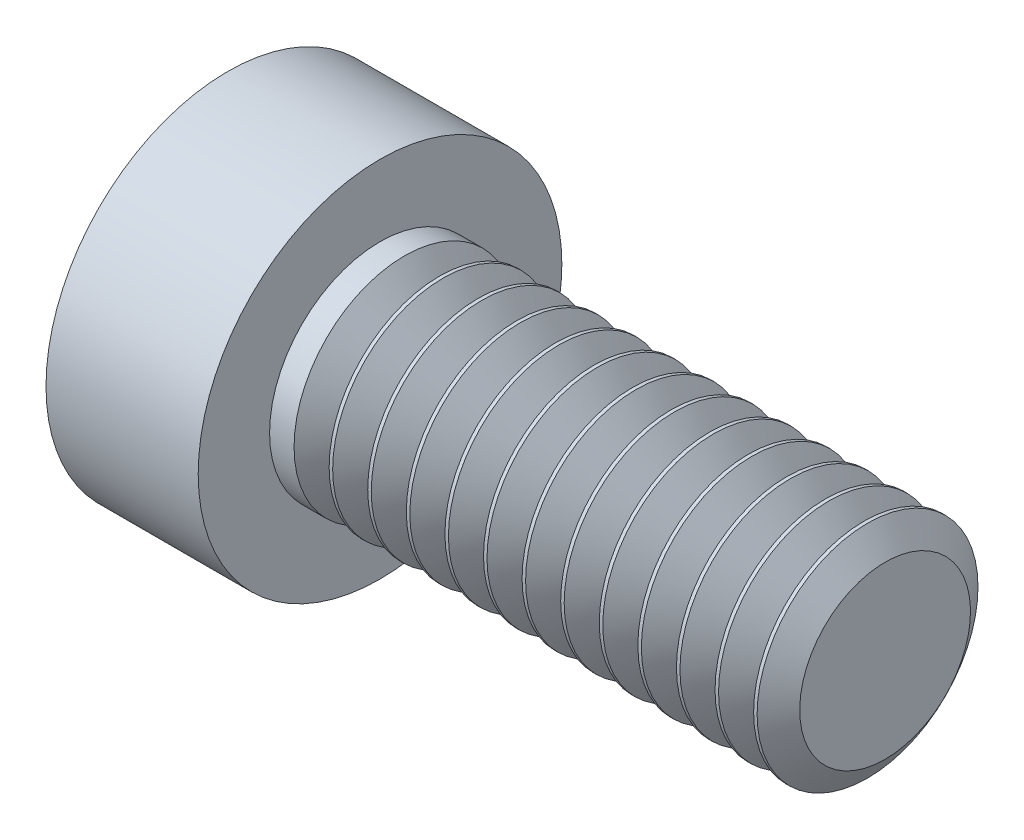
ISO-10303-21;
HEADER;
FILE_DESCRIPTION(('STEP AP214'),'2;1');
FILE_NAME('part.step','',(''),(''),'','','');
FILE_SCHEMA(('AUTOMOTIVE_DESIGN { 1 0 10303 214 1 1 1 1 }'));
ENDSEC;
DATA;
#1=APPLICATION_CONTEXT('core data for automotive mechanical design processes');
#2=APPLICATION_PROTOCOL_DEFINITION('international standard','automotive_design',2000,#1);
#3=PRODUCT_CONTEXT('',#1,'mechanical');
#4=PRODUCT('Part','Part','',(#3));
#5=PRODUCT_RELATED_PRODUCT_CATEGORY('part','',(#4));
#6=PRODUCT_DEFINITION_FORMATION('','',#4);
#7=PRODUCT_DEFINITION_CONTEXT('part definition',#1,'design');
#8=PRODUCT_DEFINITION('design','',#6,#7);
#9=PRODUCT_DEFINITION_SHAPE('','',#8);
#10=(LENGTH_UNIT() NAMED_UNIT(*) SI_UNIT(.MILLI.,.METRE.));
#11=(NAMED_UNIT(*) PLANE_ANGLE_UNIT() SI_UNIT($,.RADIAN.));
#12=(NAMED_UNIT(*) SI_UNIT($,.STERADIAN.) SOLID_ANGLE_UNIT());
#13=UNCERTAINTY_MEASURE_WITH_UNIT(LENGTH_MEASURE(1.E-05),#10,'distance_accuracy_value','');
#14=(GEOMETRIC_REPRESENTATION_CONTEXT(3) GLOBAL_UNCERTAINTY_ASSIGNED_CONTEXT((#13)) GLOBAL_UNIT_ASSIGNED_CONTEXT((#10,
#11,#12)) REPRESENTATION_CONTEXT('',''));
#15=CARTESIAN_POINT('',(0.,0.,0.));
#16=DIRECTION('',(0.,0.,1.));
#17=DIRECTION('',(1.,0.,0.));
#18=AXIS2_PLACEMENT_3D('',#15,#16,#17);
#19=CARTESIAN_POINT('',(5.92883255813953,0.,0.));
#20=DIRECTION('',(-1.,0.,0.));
#21=DIRECTION('',(0.,-1.,0.));
#22=AXIS2_PLACEMENT_3D('',#19,#20,#21);
#23=SPHERICAL_SURFACE('',#22,5.92883255813953);
#24=CARTESIAN_POINT('',(1.0922,0.,0.));
#25=DIRECTION('',(-1.,0.,0.));
#26=DIRECTION('',(0.,0.,1.));
#27=AXIS2_PLACEMENT_3D('',#24,#25,#26);
#28=CIRCLE('',#27,3.429);
#29=CARTESIAN_POINT('',(1.0922,0.,3.429));
#30=VERTEX_POINT('',#29);
#31=EDGE_CURVE('E153',#30,#30,#28,.T.);
#32=ORIENTED_EDGE('',*,*,#31,.T.);
#33=EDGE_LOOP('',(#32));
#34=FACE_BOUND('',#33,.T.);
#35=CARTESIAN_POINT('',(5.9292771673951,0.,0.00538091201608316));
#36=DIRECTION('',(-0.0823464971172504,0.,-0.996603759983133));
#37=DIRECTION('',(-0.996603759983133,0.,0.0823464971172504));
#38=AXIS2_PLACEMENT_3D('',#35,#36,#37);
#39=CIRCLE('',#38,5.92883009965404);
#40=CARTESIAN_POINT('',(0.449539654034136,2.21776869974055,0.458155833670909));
#41=VERTEX_POINT('',#40);
#42=CARTESIAN_POINT('',(0.0409557833424661,0.4919159416306,0.491915941630601));
#43=VERTEX_POINT('',#42);
#44=EDGE_CURVE('E124',#41,#43,#39,.F.);
#45=ORIENTED_EDGE('',*,*,#44,.T.);
#46=CARTESIAN_POINT('',(5.92927716739509,0.00538091201608327,0.));
#47=DIRECTION('',(-0.0823464971172504,-0.996603759983133,0.));
#48=DIRECTION('',(0.996603759983133,-0.0823464971172504,0.));
#49=AXIS2_PLACEMENT_3D('',#46,#47,#48);
#50=CIRCLE('',#49,5.92883009965404);
#51=CARTESIAN_POINT('',(0.449539654034135,0.458155833670901,2.21776869974055));
#52=VERTEX_POINT('',#51);
#53=EDGE_CURVE('E106',#43,#52,#50,.F.);
#54=ORIENTED_EDGE('',*,*,#53,.T.);
#55=CARTESIAN_POINT('',(4.95160556231038,0.,-1.26370175899002));
#56=DIRECTION('',(0.611733657338523,0.,0.791063797982966));
#57=DIRECTION('',(0.791063797982966,0.,-0.611733657338523));
#58=AXIS2_PLACEMENT_3D('',#55,#56,#57);
#59=CIRCLE('',#58,5.70956572476433);
#60=CARTESIAN_POINT('',(0.449539654034136,-0.458155833670916,2.21776869974055));
#61=VERTEX_POINT('',#60);
#62=EDGE_CURVE('E117',#61,#52,#59,.F.);
#63=ORIENTED_EDGE('',*,*,#62,.F.);
#64=CARTESIAN_POINT('',(5.9292771673951,-0.00538091201608316,0.));
#65=DIRECTION('',(-0.0823464971172504,0.996603759983133,0.));
#66=DIRECTION('',(-0.996603759983133,-0.0823464971172504,0.));
#67=AXIS2_PLACEMENT_3D('',#64,#65,#66);
#68=CIRCLE('',#67,5.92883009965404);
#69=CARTESIAN_POINT('',(0.0409557833424669,-0.491915941630603,0.491915941630601));
#70=VERTEX_POINT('',#69);
#71=EDGE_CURVE('E183',#61,#70,#68,.F.);
#72=ORIENTED_EDGE('',*,*,#71,.T.);
#73=CARTESIAN_POINT('',(0.449539654034136,-2.21776869974055,0.458155833670908));
#74=VERTEX_POINT('',#73);
#75=EDGE_CURVE('E158',#70,#74,#39,.F.);
#76=ORIENTED_EDGE('',*,*,#75,.T.);
#77=CARTESIAN_POINT('',(4.95160556231038,1.26370175899002,0.));
#78=DIRECTION('',(0.611733657338523,-0.791063797982966,0.));
#79=DIRECTION('',(0.791063797982966,0.611733657338523,0.));
#80=AXIS2_PLACEMENT_3D('',#77,#78,#79);
#81=CIRCLE('',#80,5.70956572476433);
#82=CARTESIAN_POINT('',(0.449539654034136,-2.21776869974055,-0.458155833670908));
#83=VERTEX_POINT('',#82);
#84=EDGE_CURVE('E156',#83,#74,#81,.F.);
#85=ORIENTED_EDGE('',*,*,#84,.F.);
#86=CARTESIAN_POINT('',(5.9292771673951,0.,-0.00538091201608327));
#87=DIRECTION('',(-0.0823464971172504,0.,0.996603759983133));
#88=DIRECTION('',(0.996603759983133,0.,0.0823464971172504));
#89=AXIS2_PLACEMENT_3D('',#86,#87,#88);
#90=CIRCLE('',#89,5.92883009965404);
#91=CARTESIAN_POINT('',(0.0409557833424669,-0.491915941630599,-0.491915941630601));
#92=VERTEX_POINT('',#91);
#93=EDGE_CURVE('E160',#83,#92,#90,.F.);
#94=ORIENTED_EDGE('',*,*,#93,.T.);
#95=CARTESIAN_POINT('',(0.449539654034136,-0.4581558336709,-2.21776869974055));
#96=VERTEX_POINT('',#95);
#97=EDGE_CURVE('E187',#92,#96,#68,.F.);
#98=ORIENTED_EDGE('',*,*,#97,.T.);
#99=CARTESIAN_POINT('',(4.95160556231038,0.,1.26370175899002));
#100=DIRECTION('',(0.611733657338523,0.,-0.791063797982966));
#101=DIRECTION('',(-0.791063797982966,0.,-0.611733657338523));
#102=AXIS2_PLACEMENT_3D('',#99,#100,#101);
#103=CIRCLE('',#102,5.70956572476433);
#104=CARTESIAN_POINT('',(0.449539654034136,0.458155833670916,-2.21776869974055));
#105=VERTEX_POINT('',#104);
#106=EDGE_CURVE('E118',#105,#96,#103,.F.);
#107=ORIENTED_EDGE('',*,*,#106,.F.);
#108=CARTESIAN_POINT('',(0.0409557833424661,0.491915941630603,-0.491915941630601));
#109=VERTEX_POINT('',#108);
#110=EDGE_CURVE('E143',#105,#109,#50,.F.);
#111=ORIENTED_EDGE('',*,*,#110,.T.);
#112=CARTESIAN_POINT('',(0.449539654034136,2.21776869974055,-0.458155833670908));
#113=VERTEX_POINT('',#112);
#114=EDGE_CURVE('E57',#109,#113,#90,.F.);
#115=ORIENTED_EDGE('',*,*,#114,.T.);
#116=CARTESIAN_POINT('',(4.95160556231038,-1.26370175899002,0.));
#117=DIRECTION('',(0.611733657338523,0.791063797982966,0.));
#118=DIRECTION('',(-0.791063797982966,0.611733657338523,0.));
#119=AXIS2_PLACEMENT_3D('',#116,#117,#118);
#120=CIRCLE('',#119,5.70956572476433);
#121=EDGE_CURVE('E42',#41,#113,#120,.F.);
#122=ORIENTED_EDGE('',*,*,#121,.F.);
#123=EDGE_LOOP('',(#45,#54,#63,#72,#76,#85,#94,#98,#107,#111,#115,#122));
#124=FACE_BOUND('',#123,.T.);
#125=ADVANCED_FACE('F34',(#34,#124),#23,.T.);
#126=CARTESIAN_POINT('',(3.31744876712329,0.,-0.221188767123288));
#127=DIRECTION('',(-0.0823464971172504,0.,0.996603759983133));
#128=DIRECTION('',(0.996603759983133,0.,0.0823464971172504));
#129=AXIS2_PLACEMENT_3D('',#126,#127,#128);
#130=PLANE('',#129);
#131=ORIENTED_EDGE('',*,*,#114,.F.);
#132=DIRECTION('',(0.993241889913469,-0.0820687154801386,0.0820687154801383));
#133=VECTOR('',#132,1.);
#134=CARTESIAN_POINT('',(3.33547876732346,0.219699000157596,-0.219699000157595));
#135=LINE('',#134,#133);
#136=CARTESIAN_POINT('',(2.9972,0.247650000000001,-0.247649999999999));
#137=VERTEX_POINT('',#136);
#138=EDGE_CURVE('E165',#109,#137,#135,.T.);
#139=ORIENTED_EDGE('',*,*,#138,.T.);
#140=DIRECTION('',(0.78937933733015,-0.610431055350646,0.0652241401607539));
#141=VECTOR('',#140,1.);
#142=CARTESIAN_POINT('',(0.,2.5654,-0.4953));
#143=LINE('',#142,#141);
#144=EDGE_CURVE('E127',#113,#137,#143,.T.);
#145=ORIENTED_EDGE('',*,*,#144,.F.);
#146=EDGE_LOOP('',(#131,#139,#145));
#147=FACE_BOUND('',#146,.T.);
#148=ADVANCED_FACE('F164',(#147),#130,.T.);
#149=DIRECTION('',(0.78937933733015,0.610431055350646,0.0652241401607539));
#150=VECTOR('',#149,1.);
#151=CARTESIAN_POINT('',(0.,-2.5654,-0.4953));
#152=LINE('',#151,#150);
#153=CARTESIAN_POINT('',(2.9972,-0.24765,-0.24765));
#154=VERTEX_POINT('',#153);
#155=EDGE_CURVE('E49',#83,#154,#152,.T.);
#156=ORIENTED_EDGE('',*,*,#155,.T.);
#157=DIRECTION('',(-0.993241889913469,-0.0820687154801381,-0.0820687154801383));
#158=VECTOR('',#157,1.);
#159=CARTESIAN_POINT('',(3.33547876732346,-0.219699000157594,-0.219699000157595));
#160=LINE('',#159,#158);
#161=EDGE_CURVE('E185',#154,#92,#160,.T.);
#162=ORIENTED_EDGE('',*,*,#161,.T.);
#163=ORIENTED_EDGE('',*,*,#93,.F.);
#164=EDGE_LOOP('',(#156,#162,#163));
#165=FACE_BOUND('',#164,.T.);
#166=ADVANCED_FACE('F337',(#165),#130,.T.);
#167=CARTESIAN_POINT('',(3.31744876712329,0.,0.221188767123288));
#168=DIRECTION('',(-0.0823464971172504,0.,-0.996603759983133));
#169=DIRECTION('',(-0.996603759983133,0.,0.0823464971172504));
#170=AXIS2_PLACEMENT_3D('',#167,#168,#169);
#171=PLANE('',#170);
#172=DIRECTION('',(0.78937933733015,-0.610431055350646,-0.065224140160754));
#173=VECTOR('',#172,1.);
#174=CARTESIAN_POINT('',(0.,2.5654,0.4953));
#175=LINE('',#174,#173);
#176=CARTESIAN_POINT('',(2.9972,0.247649999999999,0.247650000000001));
#177=VERTEX_POINT('',#176);
#178=EDGE_CURVE('E122',#41,#177,#175,.T.);
#179=ORIENTED_EDGE('',*,*,#178,.T.);
#180=DIRECTION('',(-0.993241889913469,0.0820687154801381,0.0820687154801384));
#181=VECTOR('',#180,1.);
#182=CARTESIAN_POINT('',(3.33547876732346,0.219699000157594,0.219699000157595));
#183=LINE('',#182,#181);
#184=EDGE_CURVE('E11',#177,#43,#183,.T.);
#185=ORIENTED_EDGE('',*,*,#184,.T.);
#186=ORIENTED_EDGE('',*,*,#44,.F.);
#187=EDGE_LOOP('',(#179,#185,#186));
#188=FACE_BOUND('',#187,.T.);
#189=ADVANCED_FACE('F123',(#188),#171,.T.);
#190=ORIENTED_EDGE('',*,*,#75,.F.);
#191=DIRECTION('',(0.993241889913469,0.0820687154801386,-0.0820687154801383));
#192=VECTOR('',#191,1.);
#193=CARTESIAN_POINT('',(3.33547876732346,-0.219699000157596,0.219699000157595));
#194=LINE('',#193,#192);
#195=CARTESIAN_POINT('',(2.9972,-0.24765,0.24765));
#196=VERTEX_POINT('',#195);
#197=EDGE_CURVE('E180',#70,#196,#194,.T.);
#198=ORIENTED_EDGE('',*,*,#197,.T.);
#199=DIRECTION('',(0.78937933733015,0.610431055350646,-0.0652241401607539));
#200=VECTOR('',#199,1.);
#201=CARTESIAN_POINT('',(0.,-2.5654,0.4953));
#202=LINE('',#201,#200);
#203=EDGE_CURVE('E171',#74,#196,#202,.T.);
#204=ORIENTED_EDGE('',*,*,#203,.F.);
#205=EDGE_LOOP('',(#190,#198,#204));
#206=FACE_BOUND('',#205,.T.);
#207=ADVANCED_FACE('F179',(#206),#171,.T.);
#208=CARTESIAN_POINT('',(-25.4,0.,0.));
#209=DIRECTION('',(-1.,0.,0.));
#210=DIRECTION('',(0.,0.,1.));
#211=AXIS2_PLACEMENT_3D('',#208,#209,#210);
#212=CYLINDRICAL_SURFACE('',#211,2.0828);
#213=CARTESIAN_POINT('',(4.4240739506482,0.,0.));
#214=DIRECTION('',(-1.,0.,0.));
#215=DIRECTION('',(0.,-1.,0.));
#216=AXIS2_PLACEMENT_3D('',#213,#214,#215);
#217=CIRCLE('',#216,2.0828);
#218=CARTESIAN_POINT('',(4.4240739506482,-2.0828,0.));
#219=VERTEX_POINT('',#218);
#220=EDGE_CURVE('E209',#219,#219,#217,.T.);
#221=ORIENTED_EDGE('',*,*,#220,.T.);
#222=EDGE_LOOP('',(#221));
#223=FACE_BOUND('',#222,.T.);
#224=CARTESIAN_POINT('',(3.9624,0.,0.));
#225=DIRECTION('',(-1.,0.,0.));
#226=DIRECTION('',(0.,0.,1.));
#227=AXIS2_PLACEMENT_3D('',#224,#225,#226);
#228=CIRCLE('',#227,2.0828);
#229=CARTESIAN_POINT('',(3.9624,0.,2.0828));
#230=VERTEX_POINT('',#229);
#231=EDGE_CURVE('E147',#230,#230,#228,.T.);
#232=ORIENTED_EDGE('',*,*,#231,.F.);
#233=EDGE_LOOP('',(#232));
#234=FACE_BOUND('',#233,.T.);
#235=ADVANCED_FACE('F36',(#223,#234),#212,.T.);
#236=CARTESIAN_POINT('',(-25.4,0.,0.));
#237=DIRECTION('',(-1.,0.,0.));
#238=DIRECTION('',(0.,0.,1.));
#239=AXIS2_PLACEMENT_3D('',#236,#237,#238);
#240=CYLINDRICAL_SURFACE('',#239,3.429);
#241=ORIENTED_EDGE('',*,*,#31,.F.);
#242=EDGE_LOOP('',(#241));
#243=FACE_BOUND('',#242,.T.);
#244=CARTESIAN_POINT('',(3.9624,0.,0.));
#245=DIRECTION('',(-1.,0.,0.));
#246=DIRECTION('',(0.,0.,1.));
#247=AXIS2_PLACEMENT_3D('',#244,#245,#246);
#248=CIRCLE('',#247,3.429);
#249=CARTESIAN_POINT('',(3.9624,0.,3.429));
#250=VERTEX_POINT('',#249);
#251=EDGE_CURVE('E150',#250,#250,#248,.T.);
#252=ORIENTED_EDGE('',*,*,#251,.T.);
#253=EDGE_LOOP('',(#252));
#254=FACE_BOUND('',#253,.T.);
#255=ADVANCED_FACE('F340',(#243,#254),#240,.T.);
#256=CARTESIAN_POINT('',(3.9624,2.0828,0.));
#257=DIRECTION('',(-1.,0.,0.));
#258=DIRECTION('',(0.,0.,1.));
#259=AXIS2_PLACEMENT_3D('',#256,#257,#258);
#260=PLANE('',#259);
#261=ORIENTED_EDGE('',*,*,#251,.F.);
#262=EDGE_LOOP('',(#261));
#263=FACE_BOUND('',#262,.T.);
#264=ORIENTED_EDGE('',*,*,#231,.T.);
#265=EDGE_LOOP('',(#264));
#266=FACE_BOUND('',#265,.T.);
#267=ADVANCED_FACE('F343',(#263,#266),#260,.F.);
#268=CARTESIAN_POINT('',(2.9972,0.24765,-0.24765));
#269=DIRECTION('',(-1.,0.,0.));
#270=DIRECTION('',(0.,0.,1.));
#271=AXIS2_PLACEMENT_3D('',#268,#269,#270);
#272=PLANE('',#271);
#273=DIRECTION('',(0.,1.,0.));
#274=VECTOR('',#273,1.);
#275=CARTESIAN_POINT('',(2.9972,-0.24765,-0.24765));
#276=LINE('',#275,#274);
#277=EDGE_CURVE('E140',#154,#137,#276,.T.);
#278=ORIENTED_EDGE('',*,*,#277,.F.);
#279=DIRECTION('',(0.,0.,1.));
#280=VECTOR('',#279,1.);
#281=CARTESIAN_POINT('',(2.9972,-0.24765,-0.24765));
#282=LINE('',#281,#280);
#283=EDGE_CURVE('E135',#154,#196,#282,.T.);
#284=ORIENTED_EDGE('',*,*,#283,.T.);
#285=DIRECTION('',(0.,-1.,0.));
#286=VECTOR('',#285,1.);
#287=CARTESIAN_POINT('',(2.9972,0.24765,0.24765));
#288=LINE('',#287,#286);
#289=EDGE_CURVE('E114',#177,#196,#288,.T.);
#290=ORIENTED_EDGE('',*,*,#289,.F.);
#291=DIRECTION('',(0.,0.,-1.));
#292=VECTOR('',#291,1.);
#293=CARTESIAN_POINT('',(2.9972,0.24765,0.24765));
#294=LINE('',#293,#292);
#295=EDGE_CURVE('E134',#177,#137,#294,.T.);
#296=ORIENTED_EDGE('',*,*,#295,.T.);
#297=EDGE_LOOP('',(#278,#284,#290,#296));
#298=FACE_BOUND('',#297,.T.);
#299=ADVANCED_FACE('F133',(#298),#272,.T.);
#300=CARTESIAN_POINT('',(2.9972,0.24765,0.24765));
#301=DIRECTION('',(0.611733657338523,0.791063797982966,0.));
#302=DIRECTION('',(-0.791063797982966,0.611733657338523,0.));
#303=AXIS2_PLACEMENT_3D('',#300,#301,#302);
#304=PLANE('',#303);
#305=ORIENTED_EDGE('',*,*,#121,.T.);
#306=ORIENTED_EDGE('',*,*,#144,.T.);
#307=ORIENTED_EDGE('',*,*,#295,.F.);
#308=ORIENTED_EDGE('',*,*,#178,.F.);
#309=EDGE_LOOP('',(#305,#306,#307,#308));
#310=FACE_BOUND('',#309,.T.);
#311=ADVANCED_FACE('F138',(#310),#304,.F.);
#312=CARTESIAN_POINT('',(2.9972,-0.24765,-0.24765));
#313=DIRECTION('',(0.611733657338523,-0.791063797982966,0.));
#314=DIRECTION('',(0.791063797982966,0.611733657338523,0.));
#315=AXIS2_PLACEMENT_3D('',#312,#313,#314);
#316=PLANE('',#315);
#317=ORIENTED_EDGE('',*,*,#84,.T.);
#318=ORIENTED_EDGE('',*,*,#203,.T.);
#319=ORIENTED_EDGE('',*,*,#283,.F.);
#320=ORIENTED_EDGE('',*,*,#155,.F.);
#321=EDGE_LOOP('',(#317,#318,#319,#320));
#322=FACE_BOUND('',#321,.T.);
#323=ADVANCED_FACE('F174',(#322),#316,.F.);
#324=CARTESIAN_POINT('',(3.31744876712329,0.221188767123288,0.));
#325=DIRECTION('',(-0.0823464971172504,-0.996603759983133,0.));
#326=DIRECTION('',(0.996603759983133,-0.0823464971172504,0.));
#327=AXIS2_PLACEMENT_3D('',#324,#325,#326);
#328=PLANE('',#327);
#329=ORIENTED_EDGE('',*,*,#184,.F.);
#330=DIRECTION('',(0.78937933733015,-0.0652241401607518,-0.610431055350646));
#331=VECTOR('',#330,1.);
#332=CARTESIAN_POINT('',(0.,0.495299999999991,2.5654));
#333=LINE('',#332,#331);
#334=EDGE_CURVE('E104',#52,#177,#333,.T.);
#335=ORIENTED_EDGE('',*,*,#334,.F.);
#336=ORIENTED_EDGE('',*,*,#53,.F.);
#337=EDGE_LOOP('',(#329,#335,#336));
#338=FACE_BOUND('',#337,.T.);
#339=ADVANCED_FACE('F103',(#338),#328,.T.);
#340=CARTESIAN_POINT('',(3.31744876712329,-0.221188767123288,0.));
#341=DIRECTION('',(-0.0823464971172504,0.996603759983133,0.));
#342=DIRECTION('',(-0.996603759983133,-0.0823464971172504,0.));
#343=AXIS2_PLACEMENT_3D('',#340,#341,#342);
#344=PLANE('',#343);
#345=DIRECTION('',(0.78937933733015,0.0652241401607561,-0.610431055350646));
#346=VECTOR('',#345,1.);
#347=CARTESIAN_POINT('',(0.,-0.495300000000009,2.5654));
#348=LINE('',#347,#346);
#349=EDGE_CURVE('E119',#61,#196,#348,.T.);
#350=ORIENTED_EDGE('',*,*,#349,.T.);
#351=ORIENTED_EDGE('',*,*,#197,.F.);
#352=ORIENTED_EDGE('',*,*,#71,.F.);
#353=EDGE_LOOP('',(#350,#351,#352));
#354=FACE_BOUND('',#353,.T.);
#355=ADVANCED_FACE('F360',(#354),#344,.T.);
#356=CARTESIAN_POINT('',(2.9972,-0.247650000000001,0.247649999999999));
#357=DIRECTION('',(0.611733657338523,0.,0.791063797982966));
#358=DIRECTION('',(-0.791063797982966,0.,0.611733657338523));
#359=AXIS2_PLACEMENT_3D('',#356,#357,#358);
#360=PLANE('',#359);
#361=ORIENTED_EDGE('',*,*,#62,.T.);
#362=ORIENTED_EDGE('',*,*,#334,.T.);
#363=ORIENTED_EDGE('',*,*,#289,.T.);
#364=ORIENTED_EDGE('',*,*,#349,.F.);
#365=EDGE_LOOP('',(#361,#362,#363,#364));
#366=FACE_BOUND('',#365,.T.);
#367=ADVANCED_FACE('F111',(#366),#360,.F.);
#368=DIRECTION('',(0.78937933733015,-0.0652241401607561,0.610431055350646));
#369=VECTOR('',#368,1.);
#370=CARTESIAN_POINT('',(0.,0.495300000000009,-2.5654));
#371=LINE('',#370,#369);
#372=EDGE_CURVE('E198',#105,#137,#371,.T.);
#373=ORIENTED_EDGE('',*,*,#372,.T.);
#374=ORIENTED_EDGE('',*,*,#138,.F.);
#375=ORIENTED_EDGE('',*,*,#110,.F.);
#376=EDGE_LOOP('',(#373,#374,#375));
#377=FACE_BOUND('',#376,.T.);
#378=ADVANCED_FACE('F197',(#377),#328,.T.);
#379=ORIENTED_EDGE('',*,*,#161,.F.);
#380=DIRECTION('',(0.78937933733015,0.0652241401607517,0.610431055350646));
#381=VECTOR('',#380,1.);
#382=CARTESIAN_POINT('',(0.,-0.495299999999991,-2.5654));
#383=LINE('',#382,#381);
#384=EDGE_CURVE('E202',#96,#154,#383,.T.);
#385=ORIENTED_EDGE('',*,*,#384,.F.);
#386=ORIENTED_EDGE('',*,*,#97,.F.);
#387=EDGE_LOOP('',(#379,#385,#386));
#388=FACE_BOUND('',#387,.T.);
#389=ADVANCED_FACE('F359',(#388),#344,.T.);
#390=CARTESIAN_POINT('',(2.9972,0.247650000000001,-0.247649999999999));
#391=DIRECTION('',(0.611733657338523,0.,-0.791063797982966));
#392=DIRECTION('',(0.791063797982966,0.,0.611733657338523));
#393=AXIS2_PLACEMENT_3D('',#390,#391,#392);
#394=PLANE('',#393);
#395=ORIENTED_EDGE('',*,*,#106,.T.);
#396=ORIENTED_EDGE('',*,*,#384,.T.);
#397=ORIENTED_EDGE('',*,*,#277,.T.);
#398=ORIENTED_EDGE('',*,*,#372,.F.);
#399=EDGE_LOOP('',(#395,#396,#397,#398));
#400=FACE_BOUND('',#399,.T.);
#401=ADVANCED_FACE('F200',(#400),#394,.F.);
#402=CARTESIAN_POINT('',(5.08568604935179,0.,0.));
#403=DIRECTION('',(1.,0.,0.));
#404=DIRECTION('',(0.,1.,0.));
#405=AXIS2_PLACEMENT_3D('',#402,#403,#404);
#406=CONICAL_SURFACE('',#405,2.0828,0.959931088596885);
#407=CARTESIAN_POINT('',(4.75488,0.,0.));
#408=DIRECTION('',(-1.,0.,0.));
#409=DIRECTION('',(0.,-1.,0.));
#410=AXIS2_PLACEMENT_3D('',#407,#408,#409);
#411=CIRCLE('',#410,1.61036);
#412=CARTESIAN_POINT('',(4.75488,-1.61036,0.));
#413=VERTEX_POINT('',#412);
#414=EDGE_CURVE('E212',#413,#413,#411,.T.);
#415=ORIENTED_EDGE('',*,*,#414,.F.);
#416=EDGE_LOOP('',(#415));
#417=FACE_BOUND('',#416,.T.);
#418=CARTESIAN_POINT('',(5.08568604935179,0.,0.));
#419=DIRECTION('',(-1.,0.,0.));
#420=DIRECTION('',(0.,-1.,0.));
#421=AXIS2_PLACEMENT_3D('',#418,#419,#420);
#422=CIRCLE('',#421,2.0828);
#423=CARTESIAN_POINT('',(5.08568604935179,-2.0828,0.));
#424=VERTEX_POINT('',#423);
#425=EDGE_CURVE('E205',#424,#424,#422,.T.);
#426=ORIENTED_EDGE('',*,*,#425,.T.);
#427=EDGE_LOOP('',(#426));
#428=FACE_BOUND('',#427,.T.);
#429=ADVANCED_FACE('F358',(#417,#428),#406,.T.);
#430=CARTESIAN_POINT('',(4.75488,0.,0.));
#431=DIRECTION('',(-1.,0.,0.));
#432=DIRECTION('',(0.,-1.,0.));
#433=AXIS2_PLACEMENT_3D('',#430,#431,#432);
#434=CONICAL_SURFACE('',#433,1.61036,0.959931088596876);
#435=ORIENTED_EDGE('',*,*,#220,.F.);
#436=EDGE_LOOP('',(#435));
#437=FACE_BOUND('',#436,.T.);
#438=ORIENTED_EDGE('',*,*,#414,.T.);
#439=EDGE_LOOP('',(#438));
#440=FACE_BOUND('',#439,.T.);
#441=ADVANCED_FACE('F369',(#437,#440),#434,.T.);
#442=CARTESIAN_POINT('',(5.1517839506482,0.,0.));
#443=DIRECTION('',(-1.,0.,0.));
#444=DIRECTION('',(0.,-1.,0.));
#445=AXIS2_PLACEMENT_3D('',#442,#443,#444);
#446=CIRCLE('',#445,2.0828);
#447=CARTESIAN_POINT('',(5.1517839506482,-2.0828,0.));
#448=VERTEX_POINT('',#447);
#449=EDGE_CURVE('E218',#448,#448,#446,.T.);
#450=ORIENTED_EDGE('',*,*,#449,.T.);
#451=EDGE_LOOP('',(#450));
#452=FACE_BOUND('',#451,.T.);
#453=ORIENTED_EDGE('',*,*,#425,.F.);
#454=EDGE_LOOP('',(#453));
#455=FACE_BOUND('',#454,.T.);
#456=ADVANCED_FACE('F373',(#452,#455),#212,.T.);
#457=CARTESIAN_POINT('',(5.81339604935179,0.,0.));
#458=DIRECTION('',(1.,0.,0.));
#459=DIRECTION('',(0.,1.,0.));
#460=AXIS2_PLACEMENT_3D('',#457,#458,#459);
#461=CONICAL_SURFACE('',#460,2.0828,0.959931088596885);
#462=CARTESIAN_POINT('',(5.48259,0.,0.));
#463=DIRECTION('',(-1.,0.,0.));
#464=DIRECTION('',(0.,-1.,0.));
#465=AXIS2_PLACEMENT_3D('',#462,#463,#464);
#466=CIRCLE('',#465,1.61036);
#467=CARTESIAN_POINT('',(5.48259,-1.61036,0.));
#468=VERTEX_POINT('',#467);
#469=EDGE_CURVE('E221',#468,#468,#466,.T.);
#470=ORIENTED_EDGE('',*,*,#469,.F.);
#471=EDGE_LOOP('',(#470));
#472=FACE_BOUND('',#471,.T.);
#473=CARTESIAN_POINT('',(5.81339604935179,0.,0.));
#474=DIRECTION('',(-1.,0.,0.));
#475=DIRECTION('',(0.,-1.,0.));
#476=AXIS2_PLACEMENT_3D('',#473,#474,#475);
#477=CIRCLE('',#476,2.0828);
#478=CARTESIAN_POINT('',(5.81339604935179,-2.0828,0.));
#479=VERTEX_POINT('',#478);
#480=EDGE_CURVE('E215',#479,#479,#477,.T.);
#481=ORIENTED_EDGE('',*,*,#480,.T.);
#482=EDGE_LOOP('',(#481));
#483=FACE_BOUND('',#482,.T.);
#484=ADVANCED_FACE('F375',(#472,#483),#461,.T.);
#485=CARTESIAN_POINT('',(5.48259,0.,0.));
#486=DIRECTION('',(-1.,0.,0.));
#487=DIRECTION('',(0.,-1.,0.));
#488=AXIS2_PLACEMENT_3D('',#485,#486,#487);
#489=CONICAL_SURFACE('',#488,1.61036,0.959931088596876);
#490=ORIENTED_EDGE('',*,*,#449,.F.);
#491=EDGE_LOOP('',(#490));
#492=FACE_BOUND('',#491,.T.);
#493=ORIENTED_EDGE('',*,*,#469,.T.);
#494=EDGE_LOOP('',(#493));
#495=FACE_BOUND('',#494,.T.);
#496=ADVANCED_FACE('F378',(#492,#495),#489,.T.);
#497=CARTESIAN_POINT('',(5.8794939506482,0.,0.));
#498=DIRECTION('',(-1.,0.,0.));
#499=DIRECTION('',(0.,-1.,0.));
#500=AXIS2_PLACEMENT_3D('',#497,#498,#499);
#501=CIRCLE('',#500,2.0828);
#502=CARTESIAN_POINT('',(5.8794939506482,-2.0828,0.));
#503=VERTEX_POINT('',#502);
#504=EDGE_CURVE('E227',#503,#503,#501,.T.);
#505=ORIENTED_EDGE('',*,*,#504,.T.);
#506=EDGE_LOOP('',(#505));
#507=FACE_BOUND('',#506,.T.);
#508=ORIENTED_EDGE('',*,*,#480,.F.);
#509=EDGE_LOOP('',(#508));
#510=FACE_BOUND('',#509,.T.);
#511=ADVANCED_FACE('F382',(#507,#510),#212,.T.);
#512=CARTESIAN_POINT('',(6.54110604935179,0.,0.));
#513=DIRECTION('',(1.,0.,0.));
#514=DIRECTION('',(0.,1.,0.));
#515=AXIS2_PLACEMENT_3D('',#512,#513,#514);
#516=CONICAL_SURFACE('',#515,2.0828,0.959931088596885);
#517=CARTESIAN_POINT('',(6.2103,0.,0.));
#518=DIRECTION('',(-1.,0.,0.));
#519=DIRECTION('',(0.,-1.,0.));
#520=AXIS2_PLACEMENT_3D('',#517,#518,#519);
#521=CIRCLE('',#520,1.61036);
#522=CARTESIAN_POINT('',(6.2103,-1.61036,0.));
#523=VERTEX_POINT('',#522);
#524=EDGE_CURVE('E230',#523,#523,#521,.T.);
#525=ORIENTED_EDGE('',*,*,#524,.F.);
#526=EDGE_LOOP('',(#525));
#527=FACE_BOUND('',#526,.T.);
#528=CARTESIAN_POINT('',(6.54110604935179,0.,0.));
#529=DIRECTION('',(-1.,0.,0.));
#530=DIRECTION('',(0.,-1.,0.));
#531=AXIS2_PLACEMENT_3D('',#528,#529,#530);
#532=CIRCLE('',#531,2.0828);
#533=CARTESIAN_POINT('',(6.54110604935179,-2.0828,0.));
#534=VERTEX_POINT('',#533);
#535=EDGE_CURVE('E224',#534,#534,#532,.T.);
#536=ORIENTED_EDGE('',*,*,#535,.T.);
#537=EDGE_LOOP('',(#536));
#538=FACE_BOUND('',#537,.T.);
#539=ADVANCED_FACE('F384',(#527,#538),#516,.T.);
#540=CARTESIAN_POINT('',(6.2103,0.,0.));
#541=DIRECTION('',(-1.,0.,0.));
#542=DIRECTION('',(0.,-1.,0.));
#543=AXIS2_PLACEMENT_3D('',#540,#541,#542);
#544=CONICAL_SURFACE('',#543,1.61036,0.959931088596876);
#545=ORIENTED_EDGE('',*,*,#504,.F.);
#546=EDGE_LOOP('',(#545));
#547=FACE_BOUND('',#546,.T.);
#548=ORIENTED_EDGE('',*,*,#524,.T.);
#549=EDGE_LOOP('',(#548));
#550=FACE_BOUND('',#549,.T.);
#551=ADVANCED_FACE('F387',(#547,#550),#544,.T.);
#552=CARTESIAN_POINT('',(6.6072039506482,0.,0.));
#553=DIRECTION('',(-1.,0.,0.));
#554=DIRECTION('',(0.,-1.,0.));
#555=AXIS2_PLACEMENT_3D('',#552,#553,#554);
#556=CIRCLE('',#555,2.0828);
#557=CARTESIAN_POINT('',(6.6072039506482,-2.0828,0.));
#558=VERTEX_POINT('',#557);
#559=EDGE_CURVE('E236',#558,#558,#556,.T.);
#560=ORIENTED_EDGE('',*,*,#559,.T.);
#561=EDGE_LOOP('',(#560));
#562=FACE_BOUND('',#561,.T.);
#563=ORIENTED_EDGE('',*,*,#535,.F.);
#564=EDGE_LOOP('',(#563));
#565=FACE_BOUND('',#564,.T.);
#566=ADVANCED_FACE('F391',(#562,#565),#212,.T.);
#567=CARTESIAN_POINT('',(7.26881604935179,0.,0.));
#568=DIRECTION('',(1.,0.,0.));
#569=DIRECTION('',(0.,1.,0.));
#570=AXIS2_PLACEMENT_3D('',#567,#568,#569);
#571=CONICAL_SURFACE('',#570,2.0828,0.959931088596885);
#572=CARTESIAN_POINT('',(6.93801,0.,0.));
#573=DIRECTION('',(-1.,0.,0.));
#574=DIRECTION('',(0.,-1.,0.));
#575=AXIS2_PLACEMENT_3D('',#572,#573,#574);
#576=CIRCLE('',#575,1.61036);
#577=CARTESIAN_POINT('',(6.93801,-1.61036,0.));
#578=VERTEX_POINT('',#577);
#579=EDGE_CURVE('E239',#578,#578,#576,.T.);
#580=ORIENTED_EDGE('',*,*,#579,.F.);
#581=EDGE_LOOP('',(#580));
#582=FACE_BOUND('',#581,.T.);
#583=CARTESIAN_POINT('',(7.26881604935179,0.,0.));
#584=DIRECTION('',(-1.,0.,0.));
#585=DIRECTION('',(0.,-1.,0.));
#586=AXIS2_PLACEMENT_3D('',#583,#584,#585);
#587=CIRCLE('',#586,2.0828);
#588=CARTESIAN_POINT('',(7.26881604935179,-2.0828,0.));
#589=VERTEX_POINT('',#588);
#590=EDGE_CURVE('E233',#589,#589,#587,.T.);
#591=ORIENTED_EDGE('',*,*,#590,.T.);
#592=EDGE_LOOP('',(#591));
#593=FACE_BOUND('',#592,.T.);
#594=ADVANCED_FACE('F393',(#582,#593),#571,.T.);
#595=CARTESIAN_POINT('',(6.93801,0.,0.));
#596=DIRECTION('',(-1.,0.,0.));
#597=DIRECTION('',(0.,-1.,0.));
#598=AXIS2_PLACEMENT_3D('',#595,#596,#597);
#599=CONICAL_SURFACE('',#598,1.61036,0.959931088596876);
#600=ORIENTED_EDGE('',*,*,#559,.F.);
#601=EDGE_LOOP('',(#600));
#602=FACE_BOUND('',#601,.T.);
#603=ORIENTED_EDGE('',*,*,#579,.T.);
#604=EDGE_LOOP('',(#603));
#605=FACE_BOUND('',#604,.T.);
#606=ADVANCED_FACE('F396',(#602,#605),#599,.T.);
#607=CARTESIAN_POINT('',(7.3349139506482,0.,0.));
#608=DIRECTION('',(-1.,0.,0.));
#609=DIRECTION('',(0.,-1.,0.));
#610=AXIS2_PLACEMENT_3D('',#607,#608,#609);
#611=CIRCLE('',#610,2.0828);
#612=CARTESIAN_POINT('',(7.3349139506482,-2.0828,0.));
#613=VERTEX_POINT('',#612);
#614=EDGE_CURVE('E245',#613,#613,#611,.T.);
#615=ORIENTED_EDGE('',*,*,#614,.T.);
#616=EDGE_LOOP('',(#615));
#617=FACE_BOUND('',#616,.T.);
#618=ORIENTED_EDGE('',*,*,#590,.F.);
#619=EDGE_LOOP('',(#618));
#620=FACE_BOUND('',#619,.T.);
#621=ADVANCED_FACE('F400',(#617,#620),#212,.T.);
#622=CARTESIAN_POINT('',(7.99652604935179,0.,0.));
#623=DIRECTION('',(1.,0.,0.));
#624=DIRECTION('',(0.,1.,0.));
#625=AXIS2_PLACEMENT_3D('',#622,#623,#624);
#626=CONICAL_SURFACE('',#625,2.0828,0.959931088596885);
#627=CARTESIAN_POINT('',(7.66572,0.,0.));
#628=DIRECTION('',(-1.,0.,0.));
#629=DIRECTION('',(0.,-1.,0.));
#630=AXIS2_PLACEMENT_3D('',#627,#628,#629);
#631=CIRCLE('',#630,1.61036);
#632=CARTESIAN_POINT('',(7.66572,-1.61036,0.));
#633=VERTEX_POINT('',#632);
#634=EDGE_CURVE('E248',#633,#633,#631,.T.);
#635=ORIENTED_EDGE('',*,*,#634,.F.);
#636=EDGE_LOOP('',(#635));
#637=FACE_BOUND('',#636,.T.);
#638=CARTESIAN_POINT('',(7.99652604935179,0.,0.));
#639=DIRECTION('',(-1.,0.,0.));
#640=DIRECTION('',(0.,-1.,0.));
#641=AXIS2_PLACEMENT_3D('',#638,#639,#640);
#642=CIRCLE('',#641,2.0828);
#643=CARTESIAN_POINT('',(7.99652604935179,-2.0828,0.));
#644=VERTEX_POINT('',#643);
#645=EDGE_CURVE('E242',#644,#644,#642,.T.);
#646=ORIENTED_EDGE('',*,*,#645,.T.);
#647=EDGE_LOOP('',(#646));
#648=FACE_BOUND('',#647,.T.);
#649=ADVANCED_FACE('F402',(#637,#648),#626,.T.);
#650=CARTESIAN_POINT('',(7.66572,0.,0.));
#651=DIRECTION('',(-1.,0.,0.));
#652=DIRECTION('',(0.,-1.,0.));
#653=AXIS2_PLACEMENT_3D('',#650,#651,#652);
#654=CONICAL_SURFACE('',#653,1.61036,0.959931088596876);
#655=ORIENTED_EDGE('',*,*,#614,.F.);
#656=EDGE_LOOP('',(#655));
#657=FACE_BOUND('',#656,.T.);
#658=ORIENTED_EDGE('',*,*,#634,.T.);
#659=EDGE_LOOP('',(#658));
#660=FACE_BOUND('',#659,.T.);
#661=ADVANCED_FACE('F405',(#657,#660),#654,.T.);
#662=CARTESIAN_POINT('',(8.0626239506482,0.,0.));
#663=DIRECTION('',(-1.,0.,0.));
#664=DIRECTION('',(0.,-1.,0.));
#665=AXIS2_PLACEMENT_3D('',#662,#663,#664);
#666=CIRCLE('',#665,2.0828);
#667=CARTESIAN_POINT('',(8.0626239506482,-2.0828,0.));
#668=VERTEX_POINT('',#667);
#669=EDGE_CURVE('E254',#668,#668,#666,.T.);
#670=ORIENTED_EDGE('',*,*,#669,.T.);
#671=EDGE_LOOP('',(#670));
#672=FACE_BOUND('',#671,.T.);
#673=ORIENTED_EDGE('',*,*,#645,.F.);
#674=EDGE_LOOP('',(#673));
#675=FACE_BOUND('',#674,.T.);
#676=ADVANCED_FACE('F409',(#672,#675),#212,.T.);
#677=CARTESIAN_POINT('',(8.72423604935179,0.,0.));
#678=DIRECTION('',(1.,0.,0.));
#679=DIRECTION('',(0.,1.,0.));
#680=AXIS2_PLACEMENT_3D('',#677,#678,#679);
#681=CONICAL_SURFACE('',#680,2.0828,0.959931088596885);
#682=CARTESIAN_POINT('',(8.39343,0.,0.));
#683=DIRECTION('',(-1.,0.,0.));
#684=DIRECTION('',(0.,-1.,0.));
#685=AXIS2_PLACEMENT_3D('',#682,#683,#684);
#686=CIRCLE('',#685,1.61036);
#687=CARTESIAN_POINT('',(8.39343,-1.61036,0.));
#688=VERTEX_POINT('',#687);
#689=EDGE_CURVE('E257',#688,#688,#686,.T.);
#690=ORIENTED_EDGE('',*,*,#689,.F.);
#691=EDGE_LOOP('',(#690));
#692=FACE_BOUND('',#691,.T.);
#693=CARTESIAN_POINT('',(8.72423604935179,0.,0.));
#694=DIRECTION('',(-1.,0.,0.));
#695=DIRECTION('',(0.,-1.,0.));
#696=AXIS2_PLACEMENT_3D('',#693,#694,#695);
#697=CIRCLE('',#696,2.0828);
#698=CARTESIAN_POINT('',(8.72423604935179,-2.0828,0.));
#699=VERTEX_POINT('',#698);
#700=EDGE_CURVE('E251',#699,#699,#697,.T.);
#701=ORIENTED_EDGE('',*,*,#700,.T.);
#702=EDGE_LOOP('',(#701));
#703=FACE_BOUND('',#702,.T.);
#704=ADVANCED_FACE('F411',(#692,#703),#681,.T.);
#705=CARTESIAN_POINT('',(8.39343,0.,0.));
#706=DIRECTION('',(-1.,0.,0.));
#707=DIRECTION('',(0.,-1.,0.));
#708=AXIS2_PLACEMENT_3D('',#705,#706,#707);
#709=CONICAL_SURFACE('',#708,1.61036,0.959931088596876);
#710=ORIENTED_EDGE('',*,*,#669,.F.);
#711=EDGE_LOOP('',(#710));
#712=FACE_BOUND('',#711,.T.);
#713=ORIENTED_EDGE('',*,*,#689,.T.);
#714=EDGE_LOOP('',(#713));
#715=FACE_BOUND('',#714,.T.);
#716=ADVANCED_FACE('F414',(#712,#715),#709,.T.);
#717=CARTESIAN_POINT('',(8.7903339506482,0.,0.));
#718=DIRECTION('',(-1.,0.,0.));
#719=DIRECTION('',(0.,-1.,0.));
#720=AXIS2_PLACEMENT_3D('',#717,#718,#719);
#721=CIRCLE('',#720,2.0828);
#722=CARTESIAN_POINT('',(8.7903339506482,-2.0828,0.));
#723=VERTEX_POINT('',#722);
#724=EDGE_CURVE('E263',#723,#723,#721,.T.);
#725=ORIENTED_EDGE('',*,*,#724,.T.);
#726=EDGE_LOOP('',(#725));
#727=FACE_BOUND('',#726,.T.);
#728=ORIENTED_EDGE('',*,*,#700,.F.);
#729=EDGE_LOOP('',(#728));
#730=FACE_BOUND('',#729,.T.);
#731=ADVANCED_FACE('F418',(#727,#730),#212,.T.);
#732=CARTESIAN_POINT('',(9.45194604935179,0.,0.));
#733=DIRECTION('',(1.,0.,0.));
#734=DIRECTION('',(0.,1.,0.));
#735=AXIS2_PLACEMENT_3D('',#732,#733,#734);
#736=CONICAL_SURFACE('',#735,2.0828,0.959931088596885);
#737=CARTESIAN_POINT('',(9.12114,0.,0.));
#738=DIRECTION('',(-1.,0.,0.));
#739=DIRECTION('',(0.,-1.,0.));
#740=AXIS2_PLACEMENT_3D('',#737,#738,#739);
#741=CIRCLE('',#740,1.61036);
#742=CARTESIAN_POINT('',(9.12114,-1.61036,0.));
#743=VERTEX_POINT('',#742);
#744=EDGE_CURVE('E266',#743,#743,#741,.T.);
#745=ORIENTED_EDGE('',*,*,#744,.F.);
#746=EDGE_LOOP('',(#745));
#747=FACE_BOUND('',#746,.T.);
#748=CARTESIAN_POINT('',(9.45194604935179,0.,0.));
#749=DIRECTION('',(-1.,0.,0.));
#750=DIRECTION('',(0.,-1.,0.));
#751=AXIS2_PLACEMENT_3D('',#748,#749,#750);
#752=CIRCLE('',#751,2.0828);
#753=CARTESIAN_POINT('',(9.45194604935179,-2.0828,0.));
#754=VERTEX_POINT('',#753);
#755=EDGE_CURVE('E260',#754,#754,#752,.T.);
#756=ORIENTED_EDGE('',*,*,#755,.T.);
#757=EDGE_LOOP('',(#756));
#758=FACE_BOUND('',#757,.T.);
#759=ADVANCED_FACE('F420',(#747,#758),#736,.T.);
#760=CARTESIAN_POINT('',(9.12114,0.,0.));
#761=DIRECTION('',(-1.,0.,0.));
#762=DIRECTION('',(0.,-1.,0.));
#763=AXIS2_PLACEMENT_3D('',#760,#761,#762);
#764=CONICAL_SURFACE('',#763,1.61036,0.959931088596876);
#765=ORIENTED_EDGE('',*,*,#724,.F.);
#766=EDGE_LOOP('',(#765));
#767=FACE_BOUND('',#766,.T.);
#768=ORIENTED_EDGE('',*,*,#744,.T.);
#769=EDGE_LOOP('',(#768));
#770=FACE_BOUND('',#769,.T.);
#771=ADVANCED_FACE('F423',(#767,#770),#764,.T.);
#772=CARTESIAN_POINT('',(9.5180439506482,0.,0.));
#773=DIRECTION('',(-1.,0.,0.));
#774=DIRECTION('',(0.,-1.,0.));
#775=AXIS2_PLACEMENT_3D('',#772,#773,#774);
#776=CIRCLE('',#775,2.0828);
#777=CARTESIAN_POINT('',(9.5180439506482,-2.0828,0.));
#778=VERTEX_POINT('',#777);
#779=EDGE_CURVE('E272',#778,#778,#776,.T.);
#780=ORIENTED_EDGE('',*,*,#779,.T.);
#781=EDGE_LOOP('',(#780));
#782=FACE_BOUND('',#781,.T.);
#783=ORIENTED_EDGE('',*,*,#755,.F.);
#784=EDGE_LOOP('',(#783));
#785=FACE_BOUND('',#784,.T.);
#786=ADVANCED_FACE('F427',(#782,#785),#212,.T.);
#787=CARTESIAN_POINT('',(10.1796560493518,0.,0.));
#788=DIRECTION('',(1.,0.,0.));
#789=DIRECTION('',(0.,1.,0.));
#790=AXIS2_PLACEMENT_3D('',#787,#788,#789);
#791=CONICAL_SURFACE('',#790,2.0828,0.959931088596885);
#792=CARTESIAN_POINT('',(9.84885,0.,0.));
#793=DIRECTION('',(-1.,0.,0.));
#794=DIRECTION('',(0.,-1.,0.));
#795=AXIS2_PLACEMENT_3D('',#792,#793,#794);
#796=CIRCLE('',#795,1.61036);
#797=CARTESIAN_POINT('',(9.84885,-1.61036,0.));
#798=VERTEX_POINT('',#797);
#799=EDGE_CURVE('E275',#798,#798,#796,.T.);
#800=ORIENTED_EDGE('',*,*,#799,.F.);
#801=EDGE_LOOP('',(#800));
#802=FACE_BOUND('',#801,.T.);
#803=CARTESIAN_POINT('',(10.1796560493518,0.,0.));
#804=DIRECTION('',(-1.,0.,0.));
#805=DIRECTION('',(0.,-1.,0.));
#806=AXIS2_PLACEMENT_3D('',#803,#804,#805);
#807=CIRCLE('',#806,2.0828);
#808=CARTESIAN_POINT('',(10.1796560493518,-2.0828,0.));
#809=VERTEX_POINT('',#808);
#810=EDGE_CURVE('E269',#809,#809,#807,.T.);
#811=ORIENTED_EDGE('',*,*,#810,.T.);
#812=EDGE_LOOP('',(#811));
#813=FACE_BOUND('',#812,.T.);
#814=ADVANCED_FACE('F429',(#802,#813),#791,.T.);
#815=CARTESIAN_POINT('',(9.84885,0.,0.));
#816=DIRECTION('',(-1.,0.,0.));
#817=DIRECTION('',(0.,-1.,0.));
#818=AXIS2_PLACEMENT_3D('',#815,#816,#817);
#819=CONICAL_SURFACE('',#818,1.61036,0.959931088596876);
#820=ORIENTED_EDGE('',*,*,#779,.F.);
#821=EDGE_LOOP('',(#820));
#822=FACE_BOUND('',#821,.T.);
#823=ORIENTED_EDGE('',*,*,#799,.T.);
#824=EDGE_LOOP('',(#823));
#825=FACE_BOUND('',#824,.T.);
#826=ADVANCED_FACE('F432',(#822,#825),#819,.T.);
#827=CARTESIAN_POINT('',(10.2457539506482,0.,0.));
#828=DIRECTION('',(-1.,0.,0.));
#829=DIRECTION('',(0.,-1.,0.));
#830=AXIS2_PLACEMENT_3D('',#827,#828,#829);
#831=CIRCLE('',#830,2.0828);
#832=CARTESIAN_POINT('',(10.2457539506482,-2.0828,0.));
#833=VERTEX_POINT('',#832);
#834=EDGE_CURVE('E281',#833,#833,#831,.T.);
#835=ORIENTED_EDGE('',*,*,#834,.T.);
#836=EDGE_LOOP('',(#835));
#837=FACE_BOUND('',#836,.T.);
#838=ORIENTED_EDGE('',*,*,#810,.F.);
#839=EDGE_LOOP('',(#838));
#840=FACE_BOUND('',#839,.T.);
#841=ADVANCED_FACE('F436',(#837,#840),#212,.T.);
#842=CARTESIAN_POINT('',(10.9073660493518,0.,0.));
#843=DIRECTION('',(1.,0.,0.));
#844=DIRECTION('',(0.,1.,0.));
#845=AXIS2_PLACEMENT_3D('',#842,#843,#844);
#846=CONICAL_SURFACE('',#845,2.0828,0.959931088596885);
#847=CARTESIAN_POINT('',(10.57656,0.,0.));
#848=DIRECTION('',(-1.,0.,0.));
#849=DIRECTION('',(0.,-1.,0.));
#850=AXIS2_PLACEMENT_3D('',#847,#848,#849);
#851=CIRCLE('',#850,1.61036);
#852=CARTESIAN_POINT('',(10.57656,-1.61036,0.));
#853=VERTEX_POINT('',#852);
#854=EDGE_CURVE('E284',#853,#853,#851,.T.);
#855=ORIENTED_EDGE('',*,*,#854,.F.);
#856=EDGE_LOOP('',(#855));
#857=FACE_BOUND('',#856,.T.);
#858=CARTESIAN_POINT('',(10.9073660493518,0.,0.));
#859=DIRECTION('',(-1.,0.,0.));
#860=DIRECTION('',(0.,-1.,0.));
#861=AXIS2_PLACEMENT_3D('',#858,#859,#860);
#862=CIRCLE('',#861,2.0828);
#863=CARTESIAN_POINT('',(10.9073660493518,-2.0828,0.));
#864=VERTEX_POINT('',#863);
#865=EDGE_CURVE('E278',#864,#864,#862,.T.);
#866=ORIENTED_EDGE('',*,*,#865,.T.);
#867=EDGE_LOOP('',(#866));
#868=FACE_BOUND('',#867,.T.);
#869=ADVANCED_FACE('F438',(#857,#868),#846,.T.);
#870=CARTESIAN_POINT('',(10.57656,0.,0.));
#871=DIRECTION('',(-1.,0.,0.));
#872=DIRECTION('',(0.,-1.,0.));
#873=AXIS2_PLACEMENT_3D('',#870,#871,#872);
#874=CONICAL_SURFACE('',#873,1.61036,0.959931088596876);
#875=ORIENTED_EDGE('',*,*,#834,.F.);
#876=EDGE_LOOP('',(#875));
#877=FACE_BOUND('',#876,.T.);
#878=ORIENTED_EDGE('',*,*,#854,.T.);
#879=EDGE_LOOP('',(#878));
#880=FACE_BOUND('',#879,.T.);
#881=ADVANCED_FACE('F441',(#877,#880),#874,.T.);
#882=CARTESIAN_POINT('',(10.9734639506482,0.,0.));
#883=DIRECTION('',(-1.,0.,0.));
#884=DIRECTION('',(0.,-1.,0.));
#885=AXIS2_PLACEMENT_3D('',#882,#883,#884);
#886=CIRCLE('',#885,2.0828);
#887=CARTESIAN_POINT('',(10.9734639506482,-2.0828,0.));
#888=VERTEX_POINT('',#887);
#889=EDGE_CURVE('E290',#888,#888,#886,.T.);
#890=ORIENTED_EDGE('',*,*,#889,.T.);
#891=EDGE_LOOP('',(#890));
#892=FACE_BOUND('',#891,.T.);
#893=ORIENTED_EDGE('',*,*,#865,.F.);
#894=EDGE_LOOP('',(#893));
#895=FACE_BOUND('',#894,.T.);
#896=ADVANCED_FACE('F445',(#892,#895),#212,.T.);
#897=CARTESIAN_POINT('',(11.6350760493518,0.,0.));
#898=DIRECTION('',(1.,0.,0.));
#899=DIRECTION('',(0.,1.,0.));
#900=AXIS2_PLACEMENT_3D('',#897,#898,#899);
#901=CONICAL_SURFACE('',#900,2.0828,0.959931088596885);
#902=CARTESIAN_POINT('',(11.30427,0.,0.));
#903=DIRECTION('',(-1.,0.,0.));
#904=DIRECTION('',(0.,-1.,0.));
#905=AXIS2_PLACEMENT_3D('',#902,#903,#904);
#906=CIRCLE('',#905,1.61036);
#907=CARTESIAN_POINT('',(11.30427,-1.61036,0.));
#908=VERTEX_POINT('',#907);
#909=EDGE_CURVE('E293',#908,#908,#906,.T.);
#910=ORIENTED_EDGE('',*,*,#909,.F.);
#911=EDGE_LOOP('',(#910));
#912=FACE_BOUND('',#911,.T.);
#913=CARTESIAN_POINT('',(11.6350760493518,0.,0.));
#914=DIRECTION('',(-1.,0.,0.));
#915=DIRECTION('',(0.,-1.,0.));
#916=AXIS2_PLACEMENT_3D('',#913,#914,#915);
#917=CIRCLE('',#916,2.0828);
#918=CARTESIAN_POINT('',(11.6350760493518,-2.0828,0.));
#919=VERTEX_POINT('',#918);
#920=EDGE_CURVE('E287',#919,#919,#917,.T.);
#921=ORIENTED_EDGE('',*,*,#920,.T.);
#922=EDGE_LOOP('',(#921));
#923=FACE_BOUND('',#922,.T.);
#924=ADVANCED_FACE('F447',(#912,#923),#901,.T.);
#925=CARTESIAN_POINT('',(11.30427,0.,0.));
#926=DIRECTION('',(-1.,0.,0.));
#927=DIRECTION('',(0.,-1.,0.));
#928=AXIS2_PLACEMENT_3D('',#925,#926,#927);
#929=CONICAL_SURFACE('',#928,1.61036,0.959931088596876);
#930=ORIENTED_EDGE('',*,*,#889,.F.);
#931=EDGE_LOOP('',(#930));
#932=FACE_BOUND('',#931,.T.);
#933=ORIENTED_EDGE('',*,*,#909,.T.);
#934=EDGE_LOOP('',(#933));
#935=FACE_BOUND('',#934,.T.);
#936=ADVANCED_FACE('F450',(#932,#935),#929,.T.);
#937=CARTESIAN_POINT('',(11.7011739506482,0.,0.));
#938=DIRECTION('',(-1.,0.,0.));
#939=DIRECTION('',(0.,-1.,0.));
#940=AXIS2_PLACEMENT_3D('',#937,#938,#939);
#941=CIRCLE('',#940,2.0828);
#942=CARTESIAN_POINT('',(11.7011739506482,-2.0828,0.));
#943=VERTEX_POINT('',#942);
#944=EDGE_CURVE('E299',#943,#943,#941,.T.);
#945=ORIENTED_EDGE('',*,*,#944,.T.);
#946=EDGE_LOOP('',(#945));
#947=FACE_BOUND('',#946,.T.);
#948=ORIENTED_EDGE('',*,*,#920,.F.);
#949=EDGE_LOOP('',(#948));
#950=FACE_BOUND('',#949,.T.);
#951=ADVANCED_FACE('F454',(#947,#950),#212,.T.);
#952=CARTESIAN_POINT('',(12.3627860493518,0.,0.));
#953=DIRECTION('',(1.,0.,0.));
#954=DIRECTION('',(0.,1.,0.));
#955=AXIS2_PLACEMENT_3D('',#952,#953,#954);
#956=CONICAL_SURFACE('',#955,2.0828,0.959931088596885);
#957=CARTESIAN_POINT('',(12.03198,0.,0.));
#958=DIRECTION('',(-1.,0.,0.));
#959=DIRECTION('',(0.,-1.,0.));
#960=AXIS2_PLACEMENT_3D('',#957,#958,#959);
#961=CIRCLE('',#960,1.61036);
#962=CARTESIAN_POINT('',(12.03198,-1.61036,0.));
#963=VERTEX_POINT('',#962);
#964=EDGE_CURVE('E302',#963,#963,#961,.T.);
#965=ORIENTED_EDGE('',*,*,#964,.F.);
#966=EDGE_LOOP('',(#965));
#967=FACE_BOUND('',#966,.T.);
#968=CARTESIAN_POINT('',(12.3627860493518,0.,0.));
#969=DIRECTION('',(-1.,0.,0.));
#970=DIRECTION('',(0.,-1.,0.));
#971=AXIS2_PLACEMENT_3D('',#968,#969,#970);
#972=CIRCLE('',#971,2.0828);
#973=CARTESIAN_POINT('',(12.3627860493518,-2.0828,0.));
#974=VERTEX_POINT('',#973);
#975=EDGE_CURVE('E296',#974,#974,#972,.T.);
#976=ORIENTED_EDGE('',*,*,#975,.T.);
#977=EDGE_LOOP('',(#976));
#978=FACE_BOUND('',#977,.T.);
#979=ADVANCED_FACE('F456',(#967,#978),#956,.T.);
#980=CARTESIAN_POINT('',(12.03198,0.,0.));
#981=DIRECTION('',(-1.,0.,0.));
#982=DIRECTION('',(0.,-1.,0.));
#983=AXIS2_PLACEMENT_3D('',#980,#981,#982);
#984=CONICAL_SURFACE('',#983,1.61036,0.959931088596876);
#985=ORIENTED_EDGE('',*,*,#944,.F.);
#986=EDGE_LOOP('',(#985));
#987=FACE_BOUND('',#986,.T.);
#988=ORIENTED_EDGE('',*,*,#964,.T.);
#989=EDGE_LOOP('',(#988));
#990=FACE_BOUND('',#989,.T.);
#991=ADVANCED_FACE('F459',(#987,#990),#984,.T.);
#992=CARTESIAN_POINT('',(12.4288839506482,0.,0.));
#993=DIRECTION('',(-1.,0.,0.));
#994=DIRECTION('',(0.,-1.,0.));
#995=AXIS2_PLACEMENT_3D('',#992,#993,#994);
#996=CIRCLE('',#995,2.0828);
#997=CARTESIAN_POINT('',(12.4288839506482,-2.0828,0.));
#998=VERTEX_POINT('',#997);
#999=EDGE_CURVE('E308',#998,#998,#996,.T.);
#1000=ORIENTED_EDGE('',*,*,#999,.T.);
#1001=EDGE_LOOP('',(#1000));
#1002=FACE_BOUND('',#1001,.T.);
#1003=ORIENTED_EDGE('',*,*,#975,.F.);
#1004=EDGE_LOOP('',(#1003));
#1005=FACE_BOUND('',#1004,.T.);
#1006=ADVANCED_FACE('F463',(#1002,#1005),#212,.T.);
#1007=CARTESIAN_POINT('',(13.0904960493518,0.,0.));
#1008=DIRECTION('',(1.,0.,0.));
#1009=DIRECTION('',(0.,1.,0.));
#1010=AXIS2_PLACEMENT_3D('',#1007,#1008,#1009);
#1011=CONICAL_SURFACE('',#1010,2.0828,0.959931088596885);
#1012=CARTESIAN_POINT('',(12.75969,0.,0.));
#1013=DIRECTION('',(-1.,0.,0.));
#1014=DIRECTION('',(0.,-1.,0.));
#1015=AXIS2_PLACEMENT_3D('',#1012,#1013,#1014);
#1016=CIRCLE('',#1015,1.61036);
#1017=CARTESIAN_POINT('',(12.75969,-1.61036,0.));
#1018=VERTEX_POINT('',#1017);
#1019=EDGE_CURVE('E311',#1018,#1018,#1016,.T.);
#1020=ORIENTED_EDGE('',*,*,#1019,.F.);
#1021=EDGE_LOOP('',(#1020));
#1022=FACE_BOUND('',#1021,.T.);
#1023=CARTESIAN_POINT('',(13.0904960493518,0.,0.));
#1024=DIRECTION('',(-1.,0.,0.));
#1025=DIRECTION('',(0.,-1.,0.));
#1026=AXIS2_PLACEMENT_3D('',#1023,#1024,#1025);
#1027=CIRCLE('',#1026,2.0828);
#1028=CARTESIAN_POINT('',(13.0904960493518,-2.0828,0.));
#1029=VERTEX_POINT('',#1028);
#1030=EDGE_CURVE('E305',#1029,#1029,#1027,.T.);
#1031=ORIENTED_EDGE('',*,*,#1030,.T.);
#1032=EDGE_LOOP('',(#1031));
#1033=FACE_BOUND('',#1032,.T.);
#1034=ADVANCED_FACE('F465',(#1022,#1033),#1011,.T.);
#1035=CARTESIAN_POINT('',(12.75969,0.,0.));
#1036=DIRECTION('',(-1.,0.,0.));
#1037=DIRECTION('',(0.,-1.,0.));
#1038=AXIS2_PLACEMENT_3D('',#1035,#1036,#1037);
#1039=CONICAL_SURFACE('',#1038,1.61036,0.959931088596876);
#1040=ORIENTED_EDGE('',*,*,#999,.F.);
#1041=EDGE_LOOP('',(#1040));
#1042=FACE_BOUND('',#1041,.T.);
#1043=ORIENTED_EDGE('',*,*,#1019,.T.);
#1044=EDGE_LOOP('',(#1043));
#1045=FACE_BOUND('',#1044,.T.);
#1046=ADVANCED_FACE('F468',(#1042,#1045),#1039,.T.);
#1047=CARTESIAN_POINT('',(13.1565939506482,0.,0.));
#1048=DIRECTION('',(-1.,0.,0.));
#1049=DIRECTION('',(0.,-1.,0.));
#1050=AXIS2_PLACEMENT_3D('',#1047,#1048,#1049);
#1051=CIRCLE('',#1050,2.0828);
#1052=CARTESIAN_POINT('',(13.1565939506482,-2.0828,0.));
#1053=VERTEX_POINT('',#1052);
#1054=EDGE_CURVE('E314',#1053,#1053,#1051,.T.);
#1055=ORIENTED_EDGE('',*,*,#1054,.T.);
#1056=EDGE_LOOP('',(#1055));
#1057=FACE_BOUND('',#1056,.T.);
#1058=ORIENTED_EDGE('',*,*,#1030,.F.);
#1059=EDGE_LOOP('',(#1058));
#1060=FACE_BOUND('',#1059,.T.);
#1061=ADVANCED_FACE('F328',(#1057,#1060),#212,.T.);
#1062=CARTESIAN_POINT('',(13.4874,0.,0.));
#1063=DIRECTION('',(-1.,0.,0.));
#1064=DIRECTION('',(0.,-1.,0.));
#1065=AXIS2_PLACEMENT_3D('',#1062,#1063,#1064);
#1066=CONICAL_SURFACE('',#1065,1.61036,0.959931088596876);
#1067=ORIENTED_EDGE('',*,*,#1054,.F.);
#1068=EDGE_LOOP('',(#1067));
#1069=FACE_BOUND('',#1068,.T.);
#1070=CARTESIAN_POINT('',(13.4874,0.,0.));
#1071=DIRECTION('',(-1.,0.,0.));
#1072=DIRECTION('',(0.,-1.,0.));
#1073=AXIS2_PLACEMENT_3D('',#1070,#1071,#1072);
#1074=CIRCLE('',#1073,1.61036);
#1075=CARTESIAN_POINT('',(13.4874,-1.61036,0.));
#1076=VERTEX_POINT('',#1075);
#1077=EDGE_CURVE('E317',#1076,#1076,#1074,.T.);
#1078=ORIENTED_EDGE('',*,*,#1077,.T.);
#1079=EDGE_LOOP('',(#1078));
#1080=FACE_BOUND('',#1079,.T.);
#1081=ADVANCED_FACE('F321',(#1069,#1080),#1066,.T.);
#1082=CARTESIAN_POINT('',(13.4874,2.0828,0.));
#1083=DIRECTION('',(1.,0.,0.));
#1084=DIRECTION('',(0.,0.,-1.));
#1085=AXIS2_PLACEMENT_3D('',#1082,#1083,#1084);
#1086=PLANE('',#1085);
#1087=ORIENTED_EDGE('',*,*,#1077,.F.);
#1088=EDGE_LOOP('',(#1087));
#1089=FACE_BOUND('',#1088,.T.);
#1090=ADVANCED_FACE('F323',(#1089),#1086,.T.);
#1091=CLOSED_SHELL('',(#125,#148,#166,#189,#207,#235,#255,#267,#299,#311,#323,#339,#355,#367,
#378,#389,#401,#429,#441,#456,#484,#496,#511,#539,#551,#566,#594,#606,#621,#649,#661,#676,#704,
#716,#731,#759,#771,#786,#814,#826,#841,#869,#881,#896,#924,#936,#951,#979,#991,#1006,#1034,
#1046,#1061,#1081,#1090));
#1092=MANIFOLD_SOLID_BREP('B2',#1091);
#1093=ADVANCED_BREP_SHAPE_REPRESENTATION('',(#18,#1092),#14);
#1094=SHAPE_DEFINITION_REPRESENTATION(#9,#1093);
ENDSEC;
END-ISO-10303-21;
